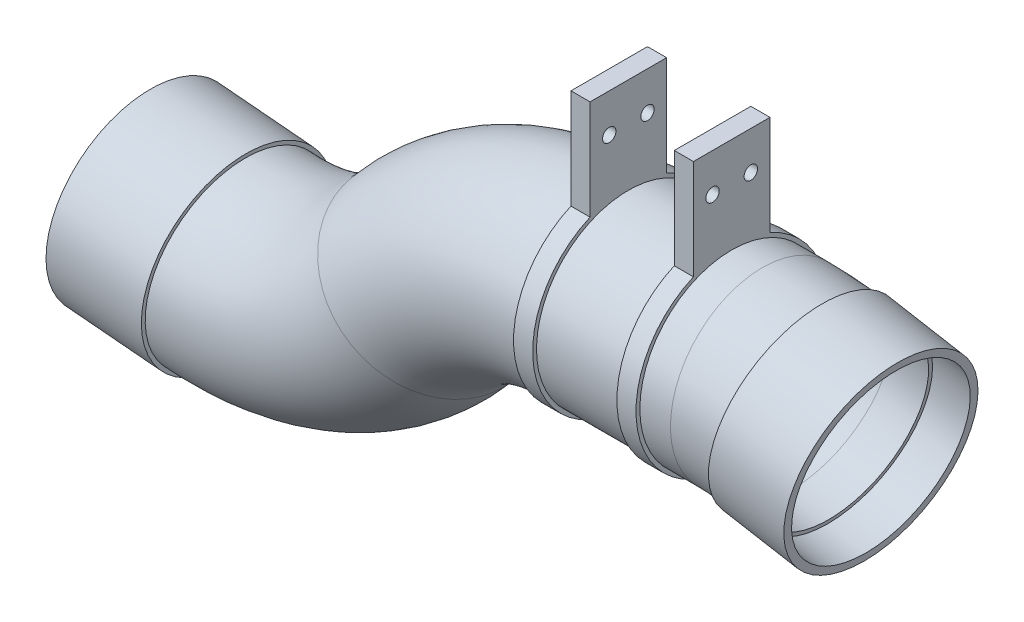
ISO-10303-21;
HEADER;
FILE_DESCRIPTION(('STEP AP214'),'2;1');
FILE_NAME('part.step','',(''),(''),'','','');
FILE_SCHEMA(('AUTOMOTIVE_DESIGN { 1 0 10303 214 1 1 1 1 }'));
ENDSEC;
DATA;
#1=APPLICATION_CONTEXT('core data for automotive mechanical design processes');
#2=APPLICATION_PROTOCOL_DEFINITION('international standard','automotive_design',2000,#1);
#3=PRODUCT_CONTEXT('',#1,'mechanical');
#4=PRODUCT('Part','Part','',(#3));
#5=PRODUCT_RELATED_PRODUCT_CATEGORY('part','',(#4));
#6=PRODUCT_DEFINITION_FORMATION('','',#4);
#7=PRODUCT_DEFINITION_CONTEXT('part definition',#1,'design');
#8=PRODUCT_DEFINITION('design','',#6,#7);
#9=PRODUCT_DEFINITION_SHAPE('','',#8);
#10=(LENGTH_UNIT() NAMED_UNIT(*) SI_UNIT(.MILLI.,.METRE.));
#11=(NAMED_UNIT(*) PLANE_ANGLE_UNIT() SI_UNIT($,.RADIAN.));
#12=(NAMED_UNIT(*) SI_UNIT($,.STERADIAN.) SOLID_ANGLE_UNIT());
#13=UNCERTAINTY_MEASURE_WITH_UNIT(LENGTH_MEASURE(1.E-05),#10,'distance_accuracy_value','');
#14=(GEOMETRIC_REPRESENTATION_CONTEXT(3) GLOBAL_UNCERTAINTY_ASSIGNED_CONTEXT((#13)) GLOBAL_UNIT_ASSIGNED_CONTEXT((#10,
#11,#12)) REPRESENTATION_CONTEXT('',''));
#15=CARTESIAN_POINT('',(0.,0.,0.));
#16=DIRECTION('',(0.,0.,1.));
#17=DIRECTION('',(1.,0.,0.));
#18=AXIS2_PLACEMENT_3D('',#15,#16,#17);
#19=CARTESIAN_POINT('',(178.099911328648,37.3051516880981,0.));
#20=DIRECTION('',(-0.984807753012209,0.173648177666924,0.));
#21=DIRECTION('',(-0.173648177666924,-0.984807753012209,0.));
#22=AXIS2_PLACEMENT_3D('',#19,#20,#21);
#23=CYLINDRICAL_SURFACE('',#22,25.);
#24=CARTESIAN_POINT('',(178.099911328648,37.3051516880981,0.));
#25=DIRECTION('',(-0.984807753012209,0.173648177666924,0.));
#26=DIRECTION('',(-0.173648177666924,-0.984807753012209,0.));
#27=AXIS2_PLACEMENT_3D('',#24,#25,#26);
#28=CIRCLE('',#27,25.);
#29=CARTESIAN_POINT('',(173.758706886975,12.6849578627929,0.));
#30=VERTEX_POINT('',#29);
#31=EDGE_CURVE('E11',#30,#30,#28,.T.);
#32=ORIENTED_EDGE('',*,*,#31,.T.);
#33=EDGE_LOOP('',(#32));
#34=FACE_BOUND('',#33,.T.);
#35=CARTESIAN_POINT('',(158.403756268404,40.7781152414366,0.));
#36=DIRECTION('',(-0.984807753012209,0.173648177666924,0.));
#37=DIRECTION('',(-0.173648177666924,-0.984807753012209,0.));
#38=AXIS2_PLACEMENT_3D('',#35,#36,#37);
#39=CIRCLE('',#38,25.);
#40=CARTESIAN_POINT('',(154.062551826731,16.1579214161314,0.));
#41=VERTEX_POINT('',#40);
#42=EDGE_CURVE('E56',#41,#41,#39,.T.);
#43=ORIENTED_EDGE('',*,*,#42,.F.);
#44=EDGE_LOOP('',(#43));
#45=FACE_BOUND('',#44,.T.);
#46=ADVANCED_FACE('F46',(#34,#45),#23,.T.);
#47=CARTESIAN_POINT('',(178.099911328648,37.3051516880981,0.));
#48=DIRECTION('',(-0.984807753012209,0.173648177666924,0.));
#49=DIRECTION('',(-0.173648177666924,-0.984807753012209,0.));
#50=AXIS2_PLACEMENT_3D('',#47,#48,#49);
#51=PLANE('',#50);
#52=CARTESIAN_POINT('',(178.099911328648,37.3051516880981,0.));
#53=DIRECTION('',(-0.984807753012209,0.173648177666924,0.));
#54=DIRECTION('',(-0.173648177666924,-0.984807753012209,0.));
#55=AXIS2_PLACEMENT_3D('',#52,#53,#54);
#56=CIRCLE('',#55,23.);
#57=CARTESIAN_POINT('',(174.106003242309,14.6545733688173,0.));
#58=VERTEX_POINT('',#57);
#59=EDGE_CURVE('E52',#58,#58,#56,.T.);
#60=ORIENTED_EDGE('',*,*,#59,.T.);
#61=EDGE_LOOP('',(#60));
#62=FACE_BOUND('',#61,.T.);
#63=ORIENTED_EDGE('',*,*,#31,.F.);
#64=EDGE_LOOP('',(#63));
#65=FACE_BOUND('',#64,.T.);
#66=ADVANCED_FACE('F75',(#62,#65),#51,.F.);
#67=CARTESIAN_POINT('',(178.099911328648,37.3051516880981,0.));
#68=DIRECTION('',(-0.984807753012209,0.173648177666924,0.));
#69=DIRECTION('',(-0.173648177666924,-0.984807753012209,0.));
#70=AXIS2_PLACEMENT_3D('',#67,#68,#69);
#71=CYLINDRICAL_SURFACE('',#70,23.);
#72=ORIENTED_EDGE('',*,*,#59,.F.);
#73=EDGE_LOOP('',(#72));
#74=FACE_BOUND('',#73,.T.);
#75=CARTESIAN_POINT('',(158.403756268404,40.7781152414366,0.));
#76=DIRECTION('',(-0.984807753012209,0.173648177666924,0.));
#77=DIRECTION('',(-0.173648177666924,-0.984807753012209,0.));
#78=AXIS2_PLACEMENT_3D('',#75,#76,#77);
#79=CIRCLE('',#78,23.);
#80=CARTESIAN_POINT('',(154.409848182065,18.1275369221557,0.));
#81=VERTEX_POINT('',#80);
#82=EDGE_CURVE('E60',#81,#81,#79,.T.);
#83=ORIENTED_EDGE('',*,*,#82,.T.);
#84=EDGE_LOOP('',(#83));
#85=FACE_BOUND('',#84,.T.);
#86=ADVANCED_FACE('F66',(#74,#85),#71,.F.);
#87=CARTESIAN_POINT('',(158.403756268404,40.7781152414366,0.));
#88=DIRECTION('',(-0.984807753012209,0.173648177666924,0.));
#89=DIRECTION('',(-0.173648177666924,-0.984807753012209,0.));
#90=AXIS2_PLACEMENT_3D('',#87,#88,#89);
#91=PLANE('',#90);
#92=ORIENTED_EDGE('',*,*,#42,.T.);
#93=EDGE_LOOP('',(#92));
#94=FACE_BOUND('',#93,.T.);
#95=ORIENTED_EDGE('',*,*,#82,.F.);
#96=EDGE_LOOP('',(#95));
#97=FACE_BOUND('',#96,.T.);
#98=ADVANCED_FACE('F68',(#94,#97),#91,.T.);
#99=CLOSED_SHELL('',(#46,#66,#86,#98));
#100=MANIFOLD_SOLID_BREP('B2',#99);
#101=CARTESIAN_POINT('',(9.96194698091746,-0.871557427476584,0.));
#102=DIRECTION('',(-0.996194698091746,0.0871557427476584,0.));
#103=DIRECTION('',(-0.0871557427476584,-0.996194698091746,0.));
#104=AXIS2_PLACEMENT_3D('',#101,#102,#103);
#105=CYLINDRICAL_SURFACE('',#104,25.);
#106=CARTESIAN_POINT('',(9.96194698091746,-0.871557427476584,0.));
#107=DIRECTION('',(-0.996194698091746,0.0871557427476584,0.));
#108=DIRECTION('',(-0.0871557427476584,-0.996194698091746,0.));
#109=AXIS2_PLACEMENT_3D('',#106,#107,#108);
#110=CIRCLE('',#109,25.);
#111=CARTESIAN_POINT('',(7.783053412226,-25.7764248797702,0.));
#112=VERTEX_POINT('',#111);
#113=EDGE_CURVE('E45',#112,#112,#110,.T.);
#114=ORIENTED_EDGE('',*,*,#113,.T.);
#115=EDGE_LOOP('',(#114));
#116=FACE_BOUND('',#115,.T.);
#117=CARTESIAN_POINT('',(-14.9429204713762,1.30733614121488,0.));
#118=DIRECTION('',(-0.996194698091746,0.0871557427476584,0.));
#119=DIRECTION('',(-0.0871557427476584,-0.996194698091746,0.));
#120=AXIS2_PLACEMENT_3D('',#117,#118,#119);
#121=CIRCLE('',#120,25.);
#122=CARTESIAN_POINT('',(-17.1218140400676,-23.5975313110788,0.));
#123=VERTEX_POINT('',#122);
#124=EDGE_CURVE('E127',#123,#123,#121,.T.);
#125=ORIENTED_EDGE('',*,*,#124,.F.);
#126=EDGE_LOOP('',(#125));
#127=FACE_BOUND('',#126,.T.);
#128=ADVANCED_FACE('F117',(#116,#127),#105,.T.);
#129=CARTESIAN_POINT('',(9.96194698091746,-0.871557427476584,0.));
#130=DIRECTION('',(-0.996194698091746,0.0871557427476584,0.));
#131=DIRECTION('',(-0.0871557427476584,-0.996194698091746,0.));
#132=AXIS2_PLACEMENT_3D('',#129,#130,#131);
#133=PLANE('',#132);
#134=CARTESIAN_POINT('',(9.96194698091746,-0.871557427476584,0.));
#135=DIRECTION('',(-0.996194698091746,0.0871557427476584,0.));
#136=DIRECTION('',(-0.0871557427476584,-0.996194698091746,0.));
#137=AXIS2_PLACEMENT_3D('',#134,#135,#136);
#138=CIRCLE('',#137,23.);
#139=CARTESIAN_POINT('',(7.95736489772131,-23.7840354835867,0.));
#140=VERTEX_POINT('',#139);
#141=EDGE_CURVE('E123',#140,#140,#138,.T.);
#142=ORIENTED_EDGE('',*,*,#141,.T.);
#143=EDGE_LOOP('',(#142));
#144=FACE_BOUND('',#143,.T.);
#145=ORIENTED_EDGE('',*,*,#113,.F.);
#146=EDGE_LOOP('',(#145));
#147=FACE_BOUND('',#146,.T.);
#148=ADVANCED_FACE('F146',(#144,#147),#133,.F.);
#149=CARTESIAN_POINT('',(9.96194698091746,-0.871557427476584,0.));
#150=DIRECTION('',(-0.996194698091746,0.0871557427476584,0.));
#151=DIRECTION('',(-0.0871557427476584,-0.996194698091746,0.));
#152=AXIS2_PLACEMENT_3D('',#149,#150,#151);
#153=CYLINDRICAL_SURFACE('',#152,23.);
#154=ORIENTED_EDGE('',*,*,#141,.F.);
#155=EDGE_LOOP('',(#154));
#156=FACE_BOUND('',#155,.T.);
#157=CARTESIAN_POINT('',(-14.9429204713762,1.30733614121488,0.));
#158=DIRECTION('',(-0.996194698091746,0.0871557427476584,0.));
#159=DIRECTION('',(-0.0871557427476584,-0.996194698091746,0.));
#160=AXIS2_PLACEMENT_3D('',#157,#158,#159);
#161=CIRCLE('',#160,23.);
#162=CARTESIAN_POINT('',(-16.9475025545723,-21.6051419148953,0.));
#163=VERTEX_POINT('',#162);
#164=EDGE_CURVE('E131',#163,#163,#161,.T.);
#165=ORIENTED_EDGE('',*,*,#164,.T.);
#166=EDGE_LOOP('',(#165));
#167=FACE_BOUND('',#166,.T.);
#168=ADVANCED_FACE('F137',(#156,#167),#153,.F.);
#169=CARTESIAN_POINT('',(-14.9429204713762,1.30733614121488,0.));
#170=DIRECTION('',(-0.996194698091746,0.0871557427476584,0.));
#171=DIRECTION('',(-0.0871557427476584,-0.996194698091746,0.));
#172=AXIS2_PLACEMENT_3D('',#169,#170,#171);
#173=PLANE('',#172);
#174=ORIENTED_EDGE('',*,*,#124,.T.);
#175=EDGE_LOOP('',(#174));
#176=FACE_BOUND('',#175,.T.);
#177=ORIENTED_EDGE('',*,*,#164,.F.);
#178=EDGE_LOOP('',(#177));
#179=FACE_BOUND('',#178,.T.);
#180=ADVANCED_FACE('F139',(#176,#179),#173,.T.);
#181=CLOSED_SHELL('',(#128,#148,#168,#180));
#182=MANIFOLD_SOLID_BREP('B6',#181);
#183=CARTESIAN_POINT('',(107.116624720054,41.765611295643,0.));
#184=DIRECTION('',(1.,0.,0.));
#185=DIRECTION('',(0.,1.,0.));
#186=AXIS2_PLACEMENT_3D('',#183,#184,#185);
#187=CYLINDRICAL_SURFACE('',#186,24.);
#188=CARTESIAN_POINT('',(147.116624720054,41.765611295643,0.));
#189=DIRECTION('',(1.,0.,0.));
#190=DIRECTION('',(0.,1.,0.));
#191=AXIS2_PLACEMENT_3D('',#188,#189,#190);
#192=CIRCLE('',#191,24.);
#193=CARTESIAN_POINT('',(147.116624720054,65.765611295643,0.));
#194=VERTEX_POINT('',#193);
#195=EDGE_CURVE('E416',#194,#194,#192,.T.);
#196=ORIENTED_EDGE('',*,*,#195,.F.);
#197=EDGE_LOOP('',(#196));
#198=FACE_BOUND('',#197,.T.);
#199=CARTESIAN_POINT('',(139.116624720054,41.7656112956429,0.));
#200=DIRECTION('',(-1.,0.,0.));
#201=DIRECTION('',(0.,-1.,0.));
#202=AXIS2_PLACEMENT_3D('',#199,#200,#201);
#203=CIRCLE('',#202,24.);
#204=CARTESIAN_POINT('',(139.116624720054,17.7656112956429,0.));
#205=VERTEX_POINT('',#204);
#206=EDGE_CURVE('E290',#205,#205,#203,.T.);
#207=ORIENTED_EDGE('',*,*,#206,.F.);
#208=EDGE_LOOP('',(#207));
#209=FACE_BOUND('',#208,.T.);
#210=ADVANCED_FACE('F179',(#198,#209),#187,.T.);
#211=CARTESIAN_POINT('',(134.116624720054,41.765611295643,0.));
#212=DIRECTION('',(-1.,0.,0.));
#213=DIRECTION('',(0.,-1.,0.));
#214=AXIS2_PLACEMENT_3D('',#211,#212,#213);
#215=CIRCLE('',#214,24.);
#216=CARTESIAN_POINT('',(134.116624720054,17.765611295643,0.));
#217=VERTEX_POINT('',#216);
#218=EDGE_CURVE('E115',#217,#217,#215,.F.);
#219=ORIENTED_EDGE('',*,*,#218,.F.);
#220=EDGE_LOOP('',(#219));
#221=FACE_BOUND('',#220,.T.);
#222=CARTESIAN_POINT('',(112.116624720054,41.7656112956429,0.));
#223=DIRECTION('',(-1.,0.,0.));
#224=DIRECTION('',(0.,-1.,0.));
#225=AXIS2_PLACEMENT_3D('',#222,#223,#224);
#226=CIRCLE('',#225,24.);
#227=CARTESIAN_POINT('',(112.116624720054,17.7656112956429,0.));
#228=VERTEX_POINT('',#227);
#229=EDGE_CURVE('E322',#228,#228,#226,.T.);
#230=ORIENTED_EDGE('',*,*,#229,.F.);
#231=EDGE_LOOP('',(#230));
#232=FACE_BOUND('',#231,.T.);
#233=ADVANCED_FACE('F432',(#221,#232),#187,.T.);
#234=CARTESIAN_POINT('',(0.,0.,0.));
#235=DIRECTION('',(0.996194698091746,-0.0871557427476584,0.));
#236=DIRECTION('',(0.0871557427476584,0.996194698091746,0.));
#237=AXIS2_PLACEMENT_3D('',#234,#235,#236);
#238=CYLINDRICAL_SURFACE('',#237,24.);
#239=CARTESIAN_POINT('',(9.96194698091746,-0.871557427476584,0.));
#240=DIRECTION('',(0.996194698091746,-0.0871557427476584,0.));
#241=DIRECTION('',(0.0871557427476584,0.996194698091746,0.));
#242=AXIS2_PLACEMENT_3D('',#239,#240,#241);
#243=CIRCLE('',#242,24.);
#244=CARTESIAN_POINT('',(7.87020915497366,-24.7802301816785,0.));
#245=VERTEX_POINT('',#244);
#246=EDGE_CURVE('E361',#245,#245,#243,.T.);
#247=ORIENTED_EDGE('',*,*,#246,.F.);
#248=EDGE_LOOP('',(#247));
#249=FACE_BOUND('',#248,.T.);
#250=CARTESIAN_POINT('',(0.,0.,0.));
#251=DIRECTION('',(0.996194698091746,-0.0871557427476584,0.));
#252=DIRECTION('',(0.0871557427476584,0.996194698091746,0.));
#253=AXIS2_PLACEMENT_3D('',#250,#251,#252);
#254=CIRCLE('',#253,24.);
#255=CARTESIAN_POINT('',(2.0917378259438,23.9086727542019,0.));
#256=VERTEX_POINT('',#255);
#257=EDGE_CURVE('E400',#256,#256,#254,.T.);
#258=ORIENTED_EDGE('',*,*,#257,.T.);
#259=EDGE_LOOP('',(#258));
#260=FACE_BOUND('',#259,.T.);
#261=ADVANCED_FACE('F517',(#249,#260),#238,.T.);
#262=CARTESIAN_POINT('',(15.191291545777,58.9001244580281,0.));
#263=DIRECTION('',(0.,0.,1.));
#264=DIRECTION('',(1.,0.,0.));
#265=AXIS2_PLACEMENT_3D('',#262,#263,#264);
#266=TOROIDAL_SURFACE('',#265,60.,24.);
#267=CARTESIAN_POINT('',(61.1539581329154,20.3328678768355,0.));
#268=DIRECTION('',(0.642787609686544,0.766044443118975,0.));
#269=DIRECTION('',(-0.766044443118975,0.642787609686544,0.));
#270=AXIS2_PLACEMENT_3D('',#267,#268,#269);
#271=CIRCLE('',#270,24.);
#272=CARTESIAN_POINT('',(79.5390247677708,4.90596524435846,0.));
#273=VERTEX_POINT('',#272);
#274=EDGE_CURVE('E408',#273,#273,#271,.T.);
#275=CARTESIAN_POINT('',(15.191291545777,58.9001244580281,0.));
#276=DIRECTION('',(0.,0.,1.));
#277=DIRECTION('',(1.,0.,0.));
#278=AXIS2_PLACEMENT_3D('',#275,#276,#277);
#279=CIRCLE('',#278,84.);
#280=EDGE_CURVE('',#245,#273,#279,.T.);
#281=ORIENTED_EDGE('',*,*,#246,.T.);
#282=ORIENTED_EDGE('',*,*,#274,.F.);
#283=ORIENTED_EDGE('',*,*,#280,.T.);
#284=ORIENTED_EDGE('',*,*,#280,.F.);
#285=EDGE_LOOP('',(#281,#283,#282,#284));
#286=FACE_BOUND('',#285,.T.);
#287=ADVANCED_FACE('F551',(#286),#266,.T.);
#288=CARTESIAN_POINT('',(107.116624720054,-18.234388704357,0.));
#289=DIRECTION('',(0.,0.,-1.));
#290=DIRECTION('',(-1.,0.,0.));
#291=AXIS2_PLACEMENT_3D('',#288,#289,#290);
#292=TOROIDAL_SURFACE('',#291,60.,24.);
#293=CARTESIAN_POINT('',(107.116624720054,41.765611295643,0.));
#294=DIRECTION('',(1.,0.,0.));
#295=DIRECTION('',(0.,1.,0.));
#296=AXIS2_PLACEMENT_3D('',#293,#294,#295);
#297=CIRCLE('',#296,24.);
#298=CARTESIAN_POINT('',(107.116624720054,65.765611295643,0.));
#299=VERTEX_POINT('',#298);
#300=EDGE_CURVE('E412',#299,#299,#297,.T.);
#301=ORIENTED_EDGE('',*,*,#300,.F.);
#302=EDGE_LOOP('',(#301));
#303=FACE_BOUND('',#302,.T.);
#304=ORIENTED_EDGE('',*,*,#274,.T.);
#305=EDGE_LOOP('',(#304));
#306=FACE_BOUND('',#305,.T.);
#307=ADVANCED_FACE('F427',(#303,#306),#292,.T.);
#308=CARTESIAN_POINT('',(147.116624720054,-23.234388704357,0.));
#309=DIRECTION('',(0.,0.,-1.));
#310=DIRECTION('',(-1.,0.,0.));
#311=AXIS2_PLACEMENT_3D('',#308,#309,#310);
#312=TOROIDAL_SURFACE('',#311,65.,24.);
#313=CARTESIAN_POINT('',(158.403756268404,40.7781152414366,0.));
#314=DIRECTION('',(0.984807753012209,-0.173648177666923,0.));
#315=DIRECTION('',(0.173648177666923,0.98480775301221,0.));
#316=AXIS2_PLACEMENT_3D('',#313,#314,#315);
#317=CIRCLE('',#316,24.);
#318=CARTESIAN_POINT('',(162.57131253241,64.4135013137296,0.));
#319=VERTEX_POINT('',#318);
#320=EDGE_CURVE('E404',#319,#319,#317,.T.);
#321=CARTESIAN_POINT('',(147.116624720054,-23.234388704357,0.));
#322=DIRECTION('',(0.,0.,-1.));
#323=DIRECTION('',(-1.,0.,0.));
#324=AXIS2_PLACEMENT_3D('',#321,#322,#323);
#325=CIRCLE('',#324,89.);
#326=EDGE_CURVE('',#194,#319,#325,.T.);
#327=ORIENTED_EDGE('',*,*,#195,.T.);
#328=ORIENTED_EDGE('',*,*,#320,.F.);
#329=ORIENTED_EDGE('',*,*,#326,.T.);
#330=ORIENTED_EDGE('',*,*,#326,.F.);
#331=EDGE_LOOP('',(#327,#329,#328,#330));
#332=FACE_BOUND('',#331,.T.);
#333=ADVANCED_FACE('F424',(#332),#312,.T.);
#334=CARTESIAN_POINT('',(158.403756268404,40.7781152414366,0.));
#335=DIRECTION('',(0.984807753012209,-0.173648177666925,0.));
#336=DIRECTION('',(0.173648177666925,0.984807753012209,0.));
#337=AXIS2_PLACEMENT_3D('',#334,#335,#336);
#338=CYLINDRICAL_SURFACE('',#337,24.);
#339=CARTESIAN_POINT('',(168.251833798526,39.0416334647673,0.));
#340=DIRECTION('',(0.984807753012209,-0.173648177666925,0.));
#341=DIRECTION('',(0.173648177666925,0.984807753012209,0.));
#342=AXIS2_PLACEMENT_3D('',#339,#340,#341);
#343=CIRCLE('',#342,24.);
#344=CARTESIAN_POINT('',(172.419390062532,62.6770195370604,0.));
#345=VERTEX_POINT('',#344);
#346=EDGE_CURVE('E374',#345,#345,#343,.T.);
#347=ORIENTED_EDGE('',*,*,#346,.F.);
#348=EDGE_LOOP('',(#347));
#349=FACE_BOUND('',#348,.T.);
#350=ORIENTED_EDGE('',*,*,#320,.T.);
#351=EDGE_LOOP('',(#350));
#352=FACE_BOUND('',#351,.T.);
#353=ADVANCED_FACE('F181',(#349,#352),#338,.T.);
#354=CARTESIAN_POINT('',(0.,0.,0.));
#355=DIRECTION('',(0.996194698091746,-0.0871557427476584,0.));
#356=DIRECTION('',(0.0871557427476584,0.996194698091746,0.));
#357=AXIS2_PLACEMENT_3D('',#354,#355,#356);
#358=PLANE('',#357);
#359=CARTESIAN_POINT('',(0.,0.,0.));
#360=DIRECTION('',(0.996194698091746,-0.0871557427476584,0.));
#361=DIRECTION('',(0.0871557427476584,0.996194698091746,0.));
#362=AXIS2_PLACEMENT_3D('',#359,#360,#361);
#363=CIRCLE('',#362,22.);
#364=CARTESIAN_POINT('',(1.91742634044848,21.9162833580184,0.));
#365=VERTEX_POINT('',#364);
#366=EDGE_CURVE('E369',#365,#365,#363,.F.);
#367=ORIENTED_EDGE('',*,*,#366,.F.);
#368=EDGE_LOOP('',(#367));
#369=FACE_BOUND('',#368,.T.);
#370=ORIENTED_EDGE('',*,*,#257,.F.);
#371=EDGE_LOOP('',(#370));
#372=FACE_BOUND('',#371,.T.);
#373=ADVANCED_FACE('F544',(#369,#372),#358,.F.);
#374=CARTESIAN_POINT('',(168.251833798526,39.0416334647673,0.));
#375=DIRECTION('',(0.984807753012209,-0.173648177666925,0.));
#376=DIRECTION('',(0.173648177666925,0.984807753012209,0.));
#377=AXIS2_PLACEMENT_3D('',#374,#375,#376);
#378=PLANE('',#377);
#379=CARTESIAN_POINT('',(168.251833798526,39.0416334647673,0.));
#380=DIRECTION('',(0.984807753012209,-0.173648177666925,0.));
#381=DIRECTION('',(0.173648177666925,0.984807753012209,0.));
#382=AXIS2_PLACEMENT_3D('',#379,#380,#381);
#383=CIRCLE('',#382,22.);
#384=CARTESIAN_POINT('',(172.072093707198,60.7074040310359,0.));
#385=VERTEX_POINT('',#384);
#386=EDGE_CURVE('E189',#385,#385,#383,.F.);
#387=ORIENTED_EDGE('',*,*,#386,.T.);
#388=EDGE_LOOP('',(#387));
#389=FACE_BOUND('',#388,.T.);
#390=ORIENTED_EDGE('',*,*,#346,.T.);
#391=EDGE_LOOP('',(#390));
#392=FACE_BOUND('',#391,.T.);
#393=ADVANCED_FACE('F522',(#389,#392),#378,.T.);
#394=CARTESIAN_POINT('',(0.,0.,0.));
#395=DIRECTION('',(0.996194698091746,-0.0871557427476584,0.));
#396=DIRECTION('',(0.0871557427476584,0.996194698091746,0.));
#397=AXIS2_PLACEMENT_3D('',#394,#395,#396);
#398=CYLINDRICAL_SURFACE('',#397,22.);
#399=CARTESIAN_POINT('',(9.96194698091746,-0.871557427476584,0.));
#400=DIRECTION('',(0.996194698091746,-0.0871557427476584,0.));
#401=DIRECTION('',(0.0871557427476584,0.996194698091746,0.));
#402=AXIS2_PLACEMENT_3D('',#399,#400,#401);
#403=CIRCLE('',#402,22.);
#404=CARTESIAN_POINT('',(8.04452064046897,-22.787840785495,0.));
#405=VERTEX_POINT('',#404);
#406=EDGE_CURVE('E373',#405,#405,#403,.F.);
#407=ORIENTED_EDGE('',*,*,#406,.F.);
#408=EDGE_LOOP('',(#407));
#409=FACE_BOUND('',#408,.T.);
#410=ORIENTED_EDGE('',*,*,#366,.T.);
#411=EDGE_LOOP('',(#410));
#412=FACE_BOUND('',#411,.T.);
#413=ADVANCED_FACE('F518',(#409,#412),#398,.F.);
#414=CARTESIAN_POINT('',(15.191291545777,58.9001244580281,0.));
#415=DIRECTION('',(0.,0.,1.));
#416=DIRECTION('',(1.,0.,0.));
#417=AXIS2_PLACEMENT_3D('',#414,#415,#416);
#418=TOROIDAL_SURFACE('',#417,60.,22.);
#419=CARTESIAN_POINT('',(61.1539581329154,20.3328678768355,0.));
#420=DIRECTION('',(0.642787609686544,0.766044443118975,0.));
#421=DIRECTION('',(-0.766044443118975,0.642787609686544,0.));
#422=AXIS2_PLACEMENT_3D('',#419,#420,#421);
#423=CIRCLE('',#422,22.);
#424=CARTESIAN_POINT('',(78.0069358815329,6.19154046373156,0.));
#425=VERTEX_POINT('',#424);
#426=EDGE_CURVE('E378',#425,#425,#423,.F.);
#427=CARTESIAN_POINT('',(15.191291545777,58.9001244580281,0.));
#428=DIRECTION('',(0.,0.,1.));
#429=DIRECTION('',(1.,0.,0.));
#430=AXIS2_PLACEMENT_3D('',#427,#428,#429);
#431=CIRCLE('',#430,82.);
#432=EDGE_CURVE('',#405,#425,#431,.T.);
#433=ORIENTED_EDGE('',*,*,#406,.T.);
#434=ORIENTED_EDGE('',*,*,#426,.F.);
#435=ORIENTED_EDGE('',*,*,#432,.T.);
#436=ORIENTED_EDGE('',*,*,#432,.F.);
#437=EDGE_LOOP('',(#433,#435,#434,#436));
#438=FACE_BOUND('',#437,.T.);
#439=ADVANCED_FACE('F521',(#438),#418,.F.);
#440=CARTESIAN_POINT('',(107.116624720054,-18.234388704357,0.));
#441=DIRECTION('',(0.,0.,-1.));
#442=DIRECTION('',(-1.,0.,0.));
#443=AXIS2_PLACEMENT_3D('',#440,#441,#442);
#444=TOROIDAL_SURFACE('',#443,60.,22.);
#445=CARTESIAN_POINT('',(107.116624720054,41.765611295643,0.));
#446=DIRECTION('',(1.,0.,0.));
#447=DIRECTION('',(0.,1.,0.));
#448=AXIS2_PLACEMENT_3D('',#445,#446,#447);
#449=CIRCLE('',#448,22.);
#450=CARTESIAN_POINT('',(107.116624720054,63.765611295643,0.));
#451=VERTEX_POINT('',#450);
#452=EDGE_CURVE('E382',#451,#451,#449,.F.);
#453=ORIENTED_EDGE('',*,*,#452,.F.);
#454=EDGE_LOOP('',(#453));
#455=FACE_BOUND('',#454,.T.);
#456=ORIENTED_EDGE('',*,*,#426,.T.);
#457=EDGE_LOOP('',(#456));
#458=FACE_BOUND('',#457,.T.);
#459=ADVANCED_FACE('F526',(#455,#458),#444,.F.);
#460=CARTESIAN_POINT('',(107.116624720054,41.765611295643,0.));
#461=DIRECTION('',(1.,0.,0.));
#462=DIRECTION('',(0.,1.,0.));
#463=AXIS2_PLACEMENT_3D('',#460,#461,#462);
#464=CYLINDRICAL_SURFACE('',#463,22.);
#465=CARTESIAN_POINT('',(147.116624720054,41.765611295643,0.));
#466=DIRECTION('',(1.,0.,0.));
#467=DIRECTION('',(0.,1.,0.));
#468=AXIS2_PLACEMENT_3D('',#465,#466,#467);
#469=CIRCLE('',#468,22.);
#470=CARTESIAN_POINT('',(147.116624720054,63.765611295643,0.));
#471=VERTEX_POINT('',#470);
#472=EDGE_CURVE('E386',#471,#471,#469,.F.);
#473=ORIENTED_EDGE('',*,*,#472,.F.);
#474=EDGE_LOOP('',(#473));
#475=FACE_BOUND('',#474,.T.);
#476=ORIENTED_EDGE('',*,*,#452,.T.);
#477=EDGE_LOOP('',(#476));
#478=FACE_BOUND('',#477,.T.);
#479=ADVANCED_FACE('F530',(#475,#478),#464,.F.);
#480=CARTESIAN_POINT('',(147.116624720054,-23.234388704357,0.));
#481=DIRECTION('',(0.,0.,-1.));
#482=DIRECTION('',(-1.,0.,0.));
#483=AXIS2_PLACEMENT_3D('',#480,#481,#482);
#484=TOROIDAL_SURFACE('',#483,65.,22.);
#485=CARTESIAN_POINT('',(158.403756268404,40.7781152414366,0.));
#486=DIRECTION('',(0.984807753012209,-0.173648177666923,0.));
#487=DIRECTION('',(0.173648177666923,0.98480775301221,0.));
#488=AXIS2_PLACEMENT_3D('',#485,#486,#487);
#489=CIRCLE('',#488,22.);
#490=CARTESIAN_POINT('',(162.224016177076,62.4438858077052,0.));
#491=VERTEX_POINT('',#490);
#492=EDGE_CURVE('E390',#491,#491,#489,.F.);
#493=CARTESIAN_POINT('',(147.116624720054,-23.234388704357,0.));
#494=DIRECTION('',(0.,0.,-1.));
#495=DIRECTION('',(-1.,0.,0.));
#496=AXIS2_PLACEMENT_3D('',#493,#494,#495);
#497=CIRCLE('',#496,87.);
#498=EDGE_CURVE('',#471,#491,#497,.T.);
#499=ORIENTED_EDGE('',*,*,#472,.T.);
#500=ORIENTED_EDGE('',*,*,#492,.F.);
#501=ORIENTED_EDGE('',*,*,#498,.T.);
#502=ORIENTED_EDGE('',*,*,#498,.F.);
#503=EDGE_LOOP('',(#499,#501,#500,#502));
#504=FACE_BOUND('',#503,.T.);
#505=ADVANCED_FACE('F534',(#504),#484,.F.);
#506=CARTESIAN_POINT('',(158.403756268404,40.7781152414366,0.));
#507=DIRECTION('',(0.984807753012209,-0.173648177666925,0.));
#508=DIRECTION('',(0.173648177666925,0.984807753012209,0.));
#509=AXIS2_PLACEMENT_3D('',#506,#507,#508);
#510=CYLINDRICAL_SURFACE('',#509,22.);
#511=ORIENTED_EDGE('',*,*,#386,.F.);
#512=EDGE_LOOP('',(#511));
#513=FACE_BOUND('',#512,.T.);
#514=ORIENTED_EDGE('',*,*,#492,.T.);
#515=EDGE_LOOP('',(#514));
#516=FACE_BOUND('',#515,.T.);
#517=ADVANCED_FACE('F516',(#513,#516),#510,.F.);
#518=CARTESIAN_POINT('',(112.116624720055,64.6784897704221,10.));
#519=DIRECTION('',(0.,0.,1.));
#520=DIRECTION('',(0.,-1.,0.));
#521=AXIS2_PLACEMENT_3D('',#518,#519,#520);
#522=PLANE('',#521);
#523=DIRECTION('',(0.,1.,0.));
#524=VECTOR('',#523,1.);
#525=CARTESIAN_POINT('',(107.116624720055,64.6784897704222,10.));
#526=LINE('',#525,#524);
#527=CARTESIAN_POINT('',(107.116624720055,64.6784897704222,10.));
#528=VERTEX_POINT('',#527);
#529=CARTESIAN_POINT('',(107.116624720055,90.765611295643,10.));
#530=VERTEX_POINT('',#529);
#531=EDGE_CURVE('E332',#528,#530,#526,.T.);
#532=ORIENTED_EDGE('',*,*,#531,.F.);
#533=DIRECTION('',(-1.,0.,0.));
#534=VECTOR('',#533,1.);
#535=CARTESIAN_POINT('',(112.116624720055,64.6784897704221,10.));
#536=LINE('',#535,#534);
#537=CARTESIAN_POINT('',(112.116624720055,64.6784897704221,10.));
#538=VERTEX_POINT('',#537);
#539=EDGE_CURVE('E197',#538,#528,#536,.T.);
#540=ORIENTED_EDGE('',*,*,#539,.F.);
#541=DIRECTION('',(0.,1.,0.));
#542=VECTOR('',#541,1.);
#543=CARTESIAN_POINT('',(112.116624720055,64.6784897704221,10.));
#544=LINE('',#543,#542);
#545=CARTESIAN_POINT('',(112.116624720055,90.7656112956429,10.));
#546=VERTEX_POINT('',#545);
#547=EDGE_CURVE('E333',#538,#546,#544,.T.);
#548=ORIENTED_EDGE('',*,*,#547,.T.);
#549=DIRECTION('',(-1.,0.,0.));
#550=VECTOR('',#549,1.);
#551=CARTESIAN_POINT('',(112.116624720055,90.7656112956429,10.));
#552=LINE('',#551,#550);
#553=EDGE_CURVE('E226',#546,#530,#552,.T.);
#554=ORIENTED_EDGE('',*,*,#553,.T.);
#555=EDGE_LOOP('',(#532,#540,#548,#554));
#556=FACE_BOUND('',#555,.T.);
#557=ADVANCED_FACE('F509',(#556),#522,.T.);
#558=CARTESIAN_POINT('',(112.116624720054,41.7656112956429,0.));
#559=DIRECTION('',(-1.,0.,0.));
#560=DIRECTION('',(0.,-1.,0.));
#561=AXIS2_PLACEMENT_3D('',#558,#559,#560);
#562=CYLINDRICAL_SURFACE('',#561,25.);
#563=CARTESIAN_POINT('',(107.116624720054,41.765611295643,0.));
#564=DIRECTION('',(-1.,0.,0.));
#565=DIRECTION('',(0.,-1.,0.));
#566=AXIS2_PLACEMENT_3D('',#563,#564,#565);
#567=CIRCLE('',#566,25.);
#568=CARTESIAN_POINT('',(107.116624720055,64.6784897704222,-10.));
#569=VERTEX_POINT('',#568);
#570=EDGE_CURVE('E337',#569,#528,#567,.T.);
#571=ORIENTED_EDGE('',*,*,#570,.F.);
#572=DIRECTION('',(-1.,0.,0.));
#573=VECTOR('',#572,1.);
#574=CARTESIAN_POINT('',(112.116624720055,64.6784897704221,-10.));
#575=LINE('',#574,#573);
#576=CARTESIAN_POINT('',(112.116624720055,64.6784897704221,-10.));
#577=VERTEX_POINT('',#576);
#578=EDGE_CURVE('E215',#577,#569,#575,.T.);
#579=ORIENTED_EDGE('',*,*,#578,.F.);
#580=CARTESIAN_POINT('',(112.116624720054,41.7656112956429,0.));
#581=DIRECTION('',(-1.,0.,0.));
#582=DIRECTION('',(0.,-1.,0.));
#583=AXIS2_PLACEMENT_3D('',#580,#581,#582);
#584=CIRCLE('',#583,25.);
#585=EDGE_CURVE('E343',#577,#538,#584,.T.);
#586=ORIENTED_EDGE('',*,*,#585,.T.);
#587=ORIENTED_EDGE('',*,*,#539,.T.);
#588=EDGE_LOOP('',(#571,#579,#586,#587));
#589=FACE_BOUND('',#588,.T.);
#590=ADVANCED_FACE('F505',(#589),#562,.T.);
#591=CARTESIAN_POINT('',(112.116624720055,64.6784897704221,-10.));
#592=DIRECTION('',(0.,0.,-1.));
#593=DIRECTION('',(0.,1.,0.));
#594=AXIS2_PLACEMENT_3D('',#591,#592,#593);
#595=PLANE('',#594);
#596=DIRECTION('',(0.,-1.,0.));
#597=VECTOR('',#596,1.);
#598=CARTESIAN_POINT('',(107.116624720055,64.6784897704222,-10.));
#599=LINE('',#598,#597);
#600=CARTESIAN_POINT('',(107.116624720055,90.765611295643,-10.));
#601=VERTEX_POINT('',#600);
#602=EDGE_CURVE('E353',#601,#569,#599,.T.);
#603=ORIENTED_EDGE('',*,*,#602,.F.);
#604=DIRECTION('',(-1.,0.,0.));
#605=VECTOR('',#604,1.);
#606=CARTESIAN_POINT('',(112.116624720055,90.7656112956429,-10.));
#607=LINE('',#606,#605);
#608=CARTESIAN_POINT('',(112.116624720055,90.7656112956429,-10.));
#609=VERTEX_POINT('',#608);
#610=EDGE_CURVE('E364',#609,#601,#607,.T.);
#611=ORIENTED_EDGE('',*,*,#610,.F.);
#612=DIRECTION('',(0.,-1.,0.));
#613=VECTOR('',#612,1.);
#614=CARTESIAN_POINT('',(112.116624720055,64.6784897704221,-10.));
#615=LINE('',#614,#613);
#616=EDGE_CURVE('E340',#609,#577,#615,.T.);
#617=ORIENTED_EDGE('',*,*,#616,.T.);
#618=ORIENTED_EDGE('',*,*,#578,.T.);
#619=EDGE_LOOP('',(#603,#611,#617,#618));
#620=FACE_BOUND('',#619,.T.);
#621=ADVANCED_FACE('F508',(#620),#595,.T.);
#622=CARTESIAN_POINT('',(112.116624720055,90.7656112956429,10.));
#623=DIRECTION('',(0.,1.,0.));
#624=DIRECTION('',(-1.,0.,0.));
#625=AXIS2_PLACEMENT_3D('',#622,#623,#624);
#626=PLANE('',#625);
#627=DIRECTION('',(0.,0.,-1.));
#628=VECTOR('',#627,1.);
#629=CARTESIAN_POINT('',(107.116624720055,90.765611295643,10.));
#630=LINE('',#629,#628);
#631=EDGE_CURVE('E349',#530,#601,#630,.T.);
#632=ORIENTED_EDGE('',*,*,#631,.F.);
#633=ORIENTED_EDGE('',*,*,#553,.F.);
#634=DIRECTION('',(0.,0.,-1.));
#635=VECTOR('',#634,1.);
#636=CARTESIAN_POINT('',(112.116624720055,90.7656112956429,10.));
#637=LINE('',#636,#635);
#638=EDGE_CURVE('E336',#546,#609,#637,.T.);
#639=ORIENTED_EDGE('',*,*,#638,.T.);
#640=ORIENTED_EDGE('',*,*,#610,.T.);
#641=EDGE_LOOP('',(#632,#633,#639,#640));
#642=FACE_BOUND('',#641,.T.);
#643=ADVANCED_FACE('F500',(#642),#626,.T.);
#644=CARTESIAN_POINT('',(112.116624720054,41.7656112956429,0.));
#645=DIRECTION('',(-1.,0.,0.));
#646=DIRECTION('',(0.,-1.,0.));
#647=AXIS2_PLACEMENT_3D('',#644,#645,#646);
#648=PLANE('',#647);
#649=CARTESIAN_POINT('',(112.116624720055,80.7656112956429,5.));
#650=DIRECTION('',(1.,0.,0.));
#651=DIRECTION('',(0.,1.,0.));
#652=AXIS2_PLACEMENT_3D('',#649,#650,#651);
#653=CIRCLE('',#652,1.75);
#654=CARTESIAN_POINT('',(112.116624720055,82.5156112956429,5.));
#655=VERTEX_POINT('',#654);
#656=EDGE_CURVE('E313',#655,#655,#653,.T.);
#657=ORIENTED_EDGE('',*,*,#656,.F.);
#658=EDGE_LOOP('',(#657));
#659=FACE_BOUND('',#658,.T.);
#660=CARTESIAN_POINT('',(112.116624720055,80.7656112956429,-5.));
#661=DIRECTION('',(1.,0.,0.));
#662=DIRECTION('',(0.,1.,0.));
#663=AXIS2_PLACEMENT_3D('',#660,#661,#662);
#664=CIRCLE('',#663,1.75);
#665=CARTESIAN_POINT('',(112.116624720055,82.5156112956429,-5.));
#666=VERTEX_POINT('',#665);
#667=EDGE_CURVE('E307',#666,#666,#664,.T.);
#668=ORIENTED_EDGE('',*,*,#667,.F.);
#669=EDGE_LOOP('',(#668));
#670=FACE_BOUND('',#669,.T.);
#671=ORIENTED_EDGE('',*,*,#229,.T.);
#672=EDGE_LOOP('',(#671));
#673=FACE_BOUND('',#672,.T.);
#674=ORIENTED_EDGE('',*,*,#547,.F.);
#675=ORIENTED_EDGE('',*,*,#585,.F.);
#676=ORIENTED_EDGE('',*,*,#616,.F.);
#677=ORIENTED_EDGE('',*,*,#638,.F.);
#678=EDGE_LOOP('',(#674,#675,#676,#677));
#679=FACE_BOUND('',#678,.T.);
#680=ADVANCED_FACE('F497',(#659,#670,#673,#679),#648,.F.);
#681=CARTESIAN_POINT('',(107.116624720054,41.765611295643,0.));
#682=DIRECTION('',(-1.,0.,0.));
#683=DIRECTION('',(0.,-1.,0.));
#684=AXIS2_PLACEMENT_3D('',#681,#682,#683);
#685=PLANE('',#684);
#686=CARTESIAN_POINT('',(107.116624720055,80.765611295643,5.));
#687=DIRECTION('',(-1.,0.,0.));
#688=DIRECTION('',(0.,-1.,0.));
#689=AXIS2_PLACEMENT_3D('',#686,#687,#688);
#690=CIRCLE('',#689,1.75);
#691=CARTESIAN_POINT('',(107.116624720055,79.015611295643,5.));
#692=VERTEX_POINT('',#691);
#693=EDGE_CURVE('E317',#692,#692,#690,.F.);
#694=ORIENTED_EDGE('',*,*,#693,.T.);
#695=EDGE_LOOP('',(#694));
#696=FACE_BOUND('',#695,.T.);
#697=CARTESIAN_POINT('',(107.116624720055,80.765611295643,-5.));
#698=DIRECTION('',(-1.,0.,0.));
#699=DIRECTION('',(0.,-1.,0.));
#700=AXIS2_PLACEMENT_3D('',#697,#698,#699);
#701=CIRCLE('',#700,1.75);
#702=CARTESIAN_POINT('',(107.116624720055,79.015611295643,-5.));
#703=VERTEX_POINT('',#702);
#704=EDGE_CURVE('E318',#703,#703,#701,.F.);
#705=ORIENTED_EDGE('',*,*,#704,.T.);
#706=EDGE_LOOP('',(#705));
#707=FACE_BOUND('',#706,.T.);
#708=ORIENTED_EDGE('',*,*,#300,.T.);
#709=EDGE_LOOP('',(#708));
#710=FACE_BOUND('',#709,.T.);
#711=ORIENTED_EDGE('',*,*,#531,.T.);
#712=ORIENTED_EDGE('',*,*,#631,.T.);
#713=ORIENTED_EDGE('',*,*,#602,.T.);
#714=ORIENTED_EDGE('',*,*,#570,.T.);
#715=EDGE_LOOP('',(#711,#712,#713,#714));
#716=FACE_BOUND('',#715,.T.);
#717=ADVANCED_FACE('F495',(#696,#707,#710,#716),#685,.T.);
#718=CARTESIAN_POINT('',(102.166877251749,80.7656112956431,-5.));
#719=DIRECTION('',(1.,0.,0.));
#720=DIRECTION('',(0.,1.,0.));
#721=AXIS2_PLACEMENT_3D('',#718,#719,#720);
#722=CYLINDRICAL_SURFACE('',#721,1.75);
#723=ORIENTED_EDGE('',*,*,#667,.T.);
#724=EDGE_LOOP('',(#723));
#725=FACE_BOUND('',#724,.T.);
#726=ORIENTED_EDGE('',*,*,#704,.F.);
#727=EDGE_LOOP('',(#726));
#728=FACE_BOUND('',#727,.T.);
#729=ADVANCED_FACE('F491',(#725,#728),#722,.F.);
#730=CARTESIAN_POINT('',(102.166877251749,80.7656112956431,5.));
#731=DIRECTION('',(1.,0.,0.));
#732=DIRECTION('',(0.,1.,0.));
#733=AXIS2_PLACEMENT_3D('',#730,#731,#732);
#734=CYLINDRICAL_SURFACE('',#733,1.75);
#735=ORIENTED_EDGE('',*,*,#656,.T.);
#736=EDGE_LOOP('',(#735));
#737=FACE_BOUND('',#736,.T.);
#738=ORIENTED_EDGE('',*,*,#693,.F.);
#739=EDGE_LOOP('',(#738));
#740=FACE_BOUND('',#739,.T.);
#741=ADVANCED_FACE('F488',(#737,#740),#734,.F.);
#742=CARTESIAN_POINT('',(139.116624720055,64.6784897704221,10.));
#743=DIRECTION('',(0.,0.,1.));
#744=DIRECTION('',(0.,-1.,0.));
#745=AXIS2_PLACEMENT_3D('',#742,#743,#744);
#746=PLANE('',#745);
#747=DIRECTION('',(0.,1.,0.));
#748=VECTOR('',#747,1.);
#749=CARTESIAN_POINT('',(134.116624720055,64.6784897704222,10.));
#750=LINE('',#749,#748);
#751=CARTESIAN_POINT('',(134.116624720055,64.6784897704222,10.));
#752=VERTEX_POINT('',#751);
#753=CARTESIAN_POINT('',(134.116624720055,90.765611295643,10.));
#754=VERTEX_POINT('',#753);
#755=EDGE_CURVE('E297',#752,#754,#750,.T.);
#756=ORIENTED_EDGE('',*,*,#755,.F.);
#757=DIRECTION('',(-1.,0.,0.));
#758=VECTOR('',#757,1.);
#759=CARTESIAN_POINT('',(139.116624720055,64.6784897704221,10.));
#760=LINE('',#759,#758);
#761=CARTESIAN_POINT('',(139.116624720055,64.6784897704221,10.));
#762=VERTEX_POINT('',#761);
#763=EDGE_CURVE('E281',#762,#752,#760,.T.);
#764=ORIENTED_EDGE('',*,*,#763,.F.);
#765=DIRECTION('',(0.,1.,0.));
#766=VECTOR('',#765,1.);
#767=CARTESIAN_POINT('',(139.116624720055,64.6784897704221,10.));
#768=LINE('',#767,#766);
#769=CARTESIAN_POINT('',(139.116624720055,90.7656112956429,10.));
#770=VERTEX_POINT('',#769);
#771=EDGE_CURVE('E274',#762,#770,#768,.T.);
#772=ORIENTED_EDGE('',*,*,#771,.T.);
#773=DIRECTION('',(-1.,0.,0.));
#774=VECTOR('',#773,1.);
#775=CARTESIAN_POINT('',(139.116624720055,90.7656112956429,10.));
#776=LINE('',#775,#774);
#777=EDGE_CURVE('E255',#770,#754,#776,.T.);
#778=ORIENTED_EDGE('',*,*,#777,.T.);
#779=EDGE_LOOP('',(#756,#764,#772,#778));
#780=FACE_BOUND('',#779,.T.);
#781=ADVANCED_FACE('F280',(#780),#746,.T.);
#782=CARTESIAN_POINT('',(139.116624720054,41.7656112956429,0.));
#783=DIRECTION('',(-1.,0.,0.));
#784=DIRECTION('',(0.,-1.,0.));
#785=AXIS2_PLACEMENT_3D('',#782,#783,#784);
#786=CYLINDRICAL_SURFACE('',#785,25.);
#787=CARTESIAN_POINT('',(134.116624720054,41.765611295643,0.));
#788=DIRECTION('',(-1.,0.,0.));
#789=DIRECTION('',(0.,-1.,0.));
#790=AXIS2_PLACEMENT_3D('',#787,#788,#789);
#791=CIRCLE('',#790,25.);
#792=CARTESIAN_POINT('',(134.116624720055,64.6784897704222,-10.));
#793=VERTEX_POINT('',#792);
#794=EDGE_CURVE('E283',#793,#752,#791,.T.);
#795=ORIENTED_EDGE('',*,*,#794,.F.);
#796=DIRECTION('',(-1.,0.,0.));
#797=VECTOR('',#796,1.);
#798=CARTESIAN_POINT('',(139.116624720055,64.6784897704221,-10.));
#799=LINE('',#798,#797);
#800=CARTESIAN_POINT('',(139.116624720055,64.6784897704221,-10.));
#801=VERTEX_POINT('',#800);
#802=EDGE_CURVE('E308',#801,#793,#799,.T.);
#803=ORIENTED_EDGE('',*,*,#802,.F.);
#804=CARTESIAN_POINT('',(139.116624720054,41.7656112956429,0.));
#805=DIRECTION('',(-1.,0.,0.));
#806=DIRECTION('',(0.,-1.,0.));
#807=AXIS2_PLACEMENT_3D('',#804,#805,#806);
#808=CIRCLE('',#807,25.);
#809=EDGE_CURVE('E267',#801,#762,#808,.T.);
#810=ORIENTED_EDGE('',*,*,#809,.T.);
#811=ORIENTED_EDGE('',*,*,#763,.T.);
#812=EDGE_LOOP('',(#795,#803,#810,#811));
#813=FACE_BOUND('',#812,.T.);
#814=ADVANCED_FACE('F476',(#813),#786,.T.);
#815=CARTESIAN_POINT('',(139.116624720055,64.6784897704221,-10.));
#816=DIRECTION('',(0.,0.,-1.));
#817=DIRECTION('',(0.,1.,0.));
#818=AXIS2_PLACEMENT_3D('',#815,#816,#817);
#819=PLANE('',#818);
#820=DIRECTION('',(0.,-1.,0.));
#821=VECTOR('',#820,1.);
#822=CARTESIAN_POINT('',(134.116624720055,64.6784897704222,-10.));
#823=LINE('',#822,#821);
#824=CARTESIAN_POINT('',(134.116624720055,90.765611295643,-10.));
#825=VERTEX_POINT('',#824);
#826=EDGE_CURVE('E287',#825,#793,#823,.T.);
#827=ORIENTED_EDGE('',*,*,#826,.F.);
#828=DIRECTION('',(-1.,0.,0.));
#829=VECTOR('',#828,1.);
#830=CARTESIAN_POINT('',(139.116624720055,90.7656112956429,-10.));
#831=LINE('',#830,#829);
#832=CARTESIAN_POINT('',(139.116624720055,90.7656112956429,-10.));
#833=VERTEX_POINT('',#832);
#834=EDGE_CURVE('E266',#833,#825,#831,.T.);
#835=ORIENTED_EDGE('',*,*,#834,.F.);
#836=DIRECTION('',(0.,-1.,0.));
#837=VECTOR('',#836,1.);
#838=CARTESIAN_POINT('',(139.116624720055,64.6784897704221,-10.));
#839=LINE('',#838,#837);
#840=EDGE_CURVE('E277',#833,#801,#839,.T.);
#841=ORIENTED_EDGE('',*,*,#840,.T.);
#842=ORIENTED_EDGE('',*,*,#802,.T.);
#843=EDGE_LOOP('',(#827,#835,#841,#842));
#844=FACE_BOUND('',#843,.T.);
#845=ADVANCED_FACE('F479',(#844),#819,.T.);
#846=CARTESIAN_POINT('',(139.116624720055,90.7656112956429,10.));
#847=DIRECTION('',(0.,1.,0.));
#848=DIRECTION('',(-1.,0.,0.));
#849=AXIS2_PLACEMENT_3D('',#846,#847,#848);
#850=PLANE('',#849);
#851=DIRECTION('',(0.,0.,-1.));
#852=VECTOR('',#851,1.);
#853=CARTESIAN_POINT('',(134.116624720055,90.765611295643,10.));
#854=LINE('',#853,#852);
#855=EDGE_CURVE('E260',#754,#825,#854,.T.);
#856=ORIENTED_EDGE('',*,*,#855,.F.);
#857=ORIENTED_EDGE('',*,*,#777,.F.);
#858=DIRECTION('',(0.,0.,-1.));
#859=VECTOR('',#858,1.);
#860=CARTESIAN_POINT('',(139.116624720055,90.7656112956429,10.));
#861=LINE('',#860,#859);
#862=EDGE_CURVE('E258',#770,#833,#861,.T.);
#863=ORIENTED_EDGE('',*,*,#862,.T.);
#864=ORIENTED_EDGE('',*,*,#834,.T.);
#865=EDGE_LOOP('',(#856,#857,#863,#864));
#866=FACE_BOUND('',#865,.T.);
#867=ADVANCED_FACE('F257',(#866),#850,.T.);
#868=CARTESIAN_POINT('',(139.116624720054,41.7656112956429,0.));
#869=DIRECTION('',(-1.,0.,0.));
#870=DIRECTION('',(0.,-1.,0.));
#871=AXIS2_PLACEMENT_3D('',#868,#869,#870);
#872=PLANE('',#871);
#873=CARTESIAN_POINT('',(139.116624720055,80.7656112956429,5.));
#874=DIRECTION('',(1.,0.,0.));
#875=DIRECTION('',(0.,1.,0.));
#876=AXIS2_PLACEMENT_3D('',#873,#874,#875);
#877=CIRCLE('',#876,1.75);
#878=CARTESIAN_POINT('',(139.116624720055,82.5156112956429,5.));
#879=VERTEX_POINT('',#878);
#880=EDGE_CURVE('E441',#879,#879,#877,.T.);
#881=ORIENTED_EDGE('',*,*,#880,.F.);
#882=EDGE_LOOP('',(#881));
#883=FACE_BOUND('',#882,.T.);
#884=CARTESIAN_POINT('',(139.116624720055,80.7656112956429,-5.));
#885=DIRECTION('',(1.,0.,0.));
#886=DIRECTION('',(0.,1.,0.));
#887=AXIS2_PLACEMENT_3D('',#884,#885,#886);
#888=CIRCLE('',#887,1.75);
#889=CARTESIAN_POINT('',(139.116624720055,82.5156112956429,-5.));
#890=VERTEX_POINT('',#889);
#891=EDGE_CURVE('E450',#890,#890,#888,.T.);
#892=ORIENTED_EDGE('',*,*,#891,.F.);
#893=EDGE_LOOP('',(#892));
#894=FACE_BOUND('',#893,.T.);
#895=ORIENTED_EDGE('',*,*,#206,.T.);
#896=EDGE_LOOP('',(#895));
#897=FACE_BOUND('',#896,.T.);
#898=ORIENTED_EDGE('',*,*,#771,.F.);
#899=ORIENTED_EDGE('',*,*,#809,.F.);
#900=ORIENTED_EDGE('',*,*,#840,.F.);
#901=ORIENTED_EDGE('',*,*,#862,.F.);
#902=EDGE_LOOP('',(#898,#899,#900,#901));
#903=FACE_BOUND('',#902,.T.);
#904=ADVANCED_FACE('F272',(#883,#894,#897,#903),#872,.F.);
#905=CARTESIAN_POINT('',(134.116624720054,41.765611295643,0.));
#906=DIRECTION('',(-1.,0.,0.));
#907=DIRECTION('',(0.,-1.,0.));
#908=AXIS2_PLACEMENT_3D('',#905,#906,#907);
#909=PLANE('',#908);
#910=CARTESIAN_POINT('',(134.116624720055,80.765611295643,5.));
#911=DIRECTION('',(-1.,0.,0.));
#912=DIRECTION('',(0.,-1.,0.));
#913=AXIS2_PLACEMENT_3D('',#910,#911,#912);
#914=CIRCLE('',#913,1.75);
#915=CARTESIAN_POINT('',(134.116624720055,79.015611295643,5.));
#916=VERTEX_POINT('',#915);
#917=EDGE_CURVE('E438',#916,#916,#914,.F.);
#918=ORIENTED_EDGE('',*,*,#917,.T.);
#919=EDGE_LOOP('',(#918));
#920=FACE_BOUND('',#919,.T.);
#921=CARTESIAN_POINT('',(134.116624720055,80.765611295643,-5.));
#922=DIRECTION('',(-1.,0.,0.));
#923=DIRECTION('',(0.,-1.,0.));
#924=AXIS2_PLACEMENT_3D('',#921,#922,#923);
#925=CIRCLE('',#924,1.75);
#926=CARTESIAN_POINT('',(134.116624720055,79.015611295643,-5.));
#927=VERTEX_POINT('',#926);
#928=EDGE_CURVE('E447',#927,#927,#925,.F.);
#929=ORIENTED_EDGE('',*,*,#928,.T.);
#930=EDGE_LOOP('',(#929));
#931=FACE_BOUND('',#930,.T.);
#932=ORIENTED_EDGE('',*,*,#218,.T.);
#933=EDGE_LOOP('',(#932));
#934=FACE_BOUND('',#933,.T.);
#935=ORIENTED_EDGE('',*,*,#755,.T.);
#936=ORIENTED_EDGE('',*,*,#855,.T.);
#937=ORIENTED_EDGE('',*,*,#826,.T.);
#938=ORIENTED_EDGE('',*,*,#794,.T.);
#939=EDGE_LOOP('',(#935,#936,#937,#938));
#940=FACE_BOUND('',#939,.T.);
#941=ADVANCED_FACE('F457',(#920,#931,#934,#940),#909,.T.);
#942=CARTESIAN_POINT('',(102.166877251749,80.7656112956433,-5.));
#943=DIRECTION('',(1.,0.,0.));
#944=DIRECTION('',(0.,1.,0.));
#945=AXIS2_PLACEMENT_3D('',#942,#943,#944);
#946=CYLINDRICAL_SURFACE('',#945,1.75);
#947=ORIENTED_EDGE('',*,*,#891,.T.);
#948=EDGE_LOOP('',(#947));
#949=FACE_BOUND('',#948,.T.);
#950=ORIENTED_EDGE('',*,*,#928,.F.);
#951=EDGE_LOOP('',(#950));
#952=FACE_BOUND('',#951,.T.);
#953=ADVANCED_FACE('F460',(#949,#952),#946,.F.);
#954=CARTESIAN_POINT('',(102.166877251749,80.7656112956433,5.));
#955=DIRECTION('',(1.,0.,0.));
#956=DIRECTION('',(0.,1.,0.));
#957=AXIS2_PLACEMENT_3D('',#954,#955,#956);
#958=CYLINDRICAL_SURFACE('',#957,1.75);
#959=ORIENTED_EDGE('',*,*,#880,.T.);
#960=EDGE_LOOP('',(#959));
#961=FACE_BOUND('',#960,.T.);
#962=ORIENTED_EDGE('',*,*,#917,.F.);
#963=EDGE_LOOP('',(#962));
#964=FACE_BOUND('',#963,.T.);
#965=ADVANCED_FACE('F462',(#961,#964),#958,.F.);
#966=CLOSED_SHELL('',(#210,#233,#261,#287,#307,#333,#353,#373,#393,#413,#439,#459,#479,#505,
#517,#557,#590,#621,#643,#680,#717,#729,#741,#781,#814,#845,#867,#904,#941,#953,#965));
#967=MANIFOLD_SOLID_BREP('B40',#966);
#968=ADVANCED_BREP_SHAPE_REPRESENTATION('',(#18,#100,#182,#967),#14);
#969=SHAPE_DEFINITION_REPRESENTATION(#9,#968);
ENDSEC;
END-ISO-10303-21;
